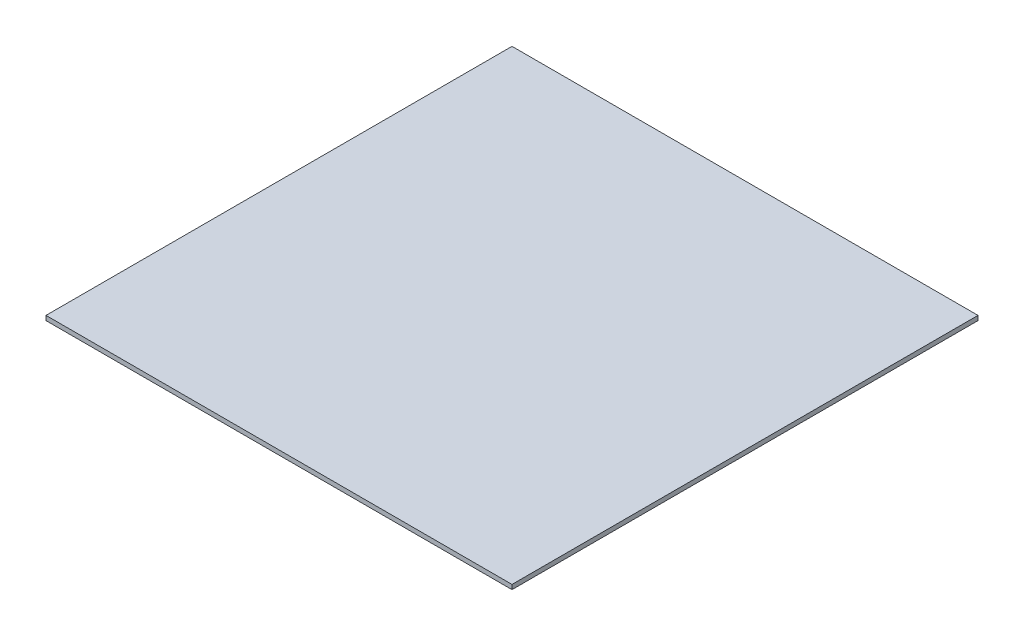
ISO-10303-21;
HEADER;
FILE_DESCRIPTION(('STEP AP214'),'2;1');
FILE_NAME('part.step','',(''),(''),'','','');
FILE_SCHEMA(('AUTOMOTIVE_DESIGN { 1 0 10303 214 1 1 1 1 }'));
ENDSEC;
DATA;
#1=APPLICATION_CONTEXT('core data for automotive mechanical design processes');
#2=APPLICATION_PROTOCOL_DEFINITION('international standard','automotive_design',2000,#1);
#3=PRODUCT_CONTEXT('',#1,'mechanical');
#4=PRODUCT('Part','Part','',(#3));
#5=PRODUCT_RELATED_PRODUCT_CATEGORY('part','',(#4));
#6=PRODUCT_DEFINITION_FORMATION('','',#4);
#7=PRODUCT_DEFINITION_CONTEXT('part definition',#1,'design');
#8=PRODUCT_DEFINITION('design','',#6,#7);
#9=PRODUCT_DEFINITION_SHAPE('','',#8);
#10=(LENGTH_UNIT() NAMED_UNIT(*) SI_UNIT(.MILLI.,.METRE.));
#11=(NAMED_UNIT(*) PLANE_ANGLE_UNIT() SI_UNIT($,.RADIAN.));
#12=(NAMED_UNIT(*) SI_UNIT($,.STERADIAN.) SOLID_ANGLE_UNIT());
#13=UNCERTAINTY_MEASURE_WITH_UNIT(LENGTH_MEASURE(1.E-05),#10,'distance_accuracy_value','');
#14=(GEOMETRIC_REPRESENTATION_CONTEXT(3) GLOBAL_UNCERTAINTY_ASSIGNED_CONTEXT((#13)) GLOBAL_UNIT_ASSIGNED_CONTEXT((#10,
#11,#12)) REPRESENTATION_CONTEXT('',''));
#15=CARTESIAN_POINT('',(0.,0.,0.));
#16=DIRECTION('',(0.,0.,1.));
#17=DIRECTION('',(1.,0.,0.));
#18=AXIS2_PLACEMENT_3D('',#15,#16,#17);
#19=CARTESIAN_POINT('',(205.,4.,205.));
#20=DIRECTION('',(-1.,0.,0.));
#21=DIRECTION('',(0.,0.,1.));
#22=AXIS2_PLACEMENT_3D('',#19,#20,#21);
#23=PLANE('',#22);
#24=DIRECTION('',(0.,0.,-1.));
#25=VECTOR('',#24,1.);
#26=CARTESIAN_POINT('',(205.,0.,205.));
#27=LINE('',#26,#25);
#28=CARTESIAN_POINT('',(205.,0.,205.));
#29=VERTEX_POINT('',#28);
#30=CARTESIAN_POINT('',(205.,0.,-205.));
#31=VERTEX_POINT('',#30);
#32=EDGE_CURVE('E100',#29,#31,#27,.T.);
#33=ORIENTED_EDGE('',*,*,#32,.T.);
#34=DIRECTION('',(0.,-1.,0.));
#35=VECTOR('',#34,1.);
#36=CARTESIAN_POINT('',(205.,4.,-205.));
#37=LINE('',#36,#35);
#38=CARTESIAN_POINT('',(205.,4.,-205.));
#39=VERTEX_POINT('',#38);
#40=EDGE_CURVE('E11',#39,#31,#37,.T.);
#41=ORIENTED_EDGE('',*,*,#40,.F.);
#42=DIRECTION('',(0.,0.,-1.));
#43=VECTOR('',#42,1.);
#44=CARTESIAN_POINT('',(205.,4.,205.));
#45=LINE('',#44,#43);
#46=CARTESIAN_POINT('',(205.,4.,205.));
#47=VERTEX_POINT('',#46);
#48=EDGE_CURVE('E88',#47,#39,#45,.T.);
#49=ORIENTED_EDGE('',*,*,#48,.F.);
#50=DIRECTION('',(0.,-1.,0.));
#51=VECTOR('',#50,1.);
#52=CARTESIAN_POINT('',(205.,4.,205.));
#53=LINE('',#52,#51);
#54=EDGE_CURVE('E96',#47,#29,#53,.T.);
#55=ORIENTED_EDGE('',*,*,#54,.T.);
#56=EDGE_LOOP('',(#33,#41,#49,#55));
#57=FACE_BOUND('',#56,.T.);
#58=ADVANCED_FACE('F37',(#57),#23,.F.);
#59=CARTESIAN_POINT('',(-205.,4.,-205.));
#60=DIRECTION('',(0.,0.,1.));
#61=DIRECTION('',(1.,0.,0.));
#62=AXIS2_PLACEMENT_3D('',#59,#60,#61);
#63=PLANE('',#62);
#64=DIRECTION('',(-1.,0.,0.));
#65=VECTOR('',#64,1.);
#66=CARTESIAN_POINT('',(-205.,0.,-205.));
#67=LINE('',#66,#65);
#68=CARTESIAN_POINT('',(-205.,0.,-205.));
#69=VERTEX_POINT('',#68);
#70=EDGE_CURVE('E92',#31,#69,#67,.T.);
#71=ORIENTED_EDGE('',*,*,#70,.T.);
#72=DIRECTION('',(0.,-1.,0.));
#73=VECTOR('',#72,1.);
#74=CARTESIAN_POINT('',(-205.,4.,-205.));
#75=LINE('',#74,#73);
#76=CARTESIAN_POINT('',(-205.,4.,-205.));
#77=VERTEX_POINT('',#76);
#78=EDGE_CURVE('E45',#77,#69,#75,.T.);
#79=ORIENTED_EDGE('',*,*,#78,.F.);
#80=DIRECTION('',(-1.,0.,0.));
#81=VECTOR('',#80,1.);
#82=CARTESIAN_POINT('',(-205.,4.,-205.));
#83=LINE('',#82,#81);
#84=EDGE_CURVE('E83',#39,#77,#83,.T.);
#85=ORIENTED_EDGE('',*,*,#84,.F.);
#86=ORIENTED_EDGE('',*,*,#40,.T.);
#87=EDGE_LOOP('',(#71,#79,#85,#86));
#88=FACE_BOUND('',#87,.T.);
#89=ADVANCED_FACE('F91',(#88),#63,.F.);
#90=CARTESIAN_POINT('',(-205.,4.,205.));
#91=DIRECTION('',(1.,0.,0.));
#92=DIRECTION('',(0.,0.,-1.));
#93=AXIS2_PLACEMENT_3D('',#90,#91,#92);
#94=PLANE('',#93);
#95=DIRECTION('',(0.,0.,1.));
#96=VECTOR('',#95,1.);
#97=CARTESIAN_POINT('',(-205.,0.,205.));
#98=LINE('',#97,#96);
#99=CARTESIAN_POINT('',(-205.,0.,205.));
#100=VERTEX_POINT('',#99);
#101=EDGE_CURVE('E70',#69,#100,#98,.T.);
#102=ORIENTED_EDGE('',*,*,#101,.T.);
#103=DIRECTION('',(0.,-1.,0.));
#104=VECTOR('',#103,1.);
#105=CARTESIAN_POINT('',(-205.,4.,205.));
#106=LINE('',#105,#104);
#107=CARTESIAN_POINT('',(-205.,4.,205.));
#108=VERTEX_POINT('',#107);
#109=EDGE_CURVE('E93',#108,#100,#106,.T.);
#110=ORIENTED_EDGE('',*,*,#109,.F.);
#111=DIRECTION('',(0.,0.,1.));
#112=VECTOR('',#111,1.);
#113=CARTESIAN_POINT('',(-205.,4.,205.));
#114=LINE('',#113,#112);
#115=EDGE_CURVE('E86',#77,#108,#114,.T.);
#116=ORIENTED_EDGE('',*,*,#115,.F.);
#117=ORIENTED_EDGE('',*,*,#78,.T.);
#118=EDGE_LOOP('',(#102,#110,#116,#117));
#119=FACE_BOUND('',#118,.T.);
#120=ADVANCED_FACE('F94',(#119),#94,.F.);
#121=CARTESIAN_POINT('',(-205.,4.,205.));
#122=DIRECTION('',(0.,0.,-1.));
#123=DIRECTION('',(-1.,0.,0.));
#124=AXIS2_PLACEMENT_3D('',#121,#122,#123);
#125=PLANE('',#124);
#126=DIRECTION('',(1.,0.,0.));
#127=VECTOR('',#126,1.);
#128=CARTESIAN_POINT('',(-205.,0.,205.));
#129=LINE('',#128,#127);
#130=EDGE_CURVE('E76',#100,#29,#129,.T.);
#131=ORIENTED_EDGE('',*,*,#130,.T.);
#132=ORIENTED_EDGE('',*,*,#54,.F.);
#133=DIRECTION('',(1.,0.,0.));
#134=VECTOR('',#133,1.);
#135=CARTESIAN_POINT('',(-205.,4.,205.));
#136=LINE('',#135,#134);
#137=EDGE_CURVE('E53',#108,#47,#136,.T.);
#138=ORIENTED_EDGE('',*,*,#137,.F.);
#139=ORIENTED_EDGE('',*,*,#109,.T.);
#140=EDGE_LOOP('',(#131,#132,#138,#139));
#141=FACE_BOUND('',#140,.T.);
#142=ADVANCED_FACE('F107',(#141),#125,.F.);
#143=CARTESIAN_POINT('',(0.,4.,0.));
#144=DIRECTION('',(0.,-1.,0.));
#145=DIRECTION('',(0.,0.,-1.));
#146=AXIS2_PLACEMENT_3D('',#143,#144,#145);
#147=PLANE('',#146);
#148=ORIENTED_EDGE('',*,*,#48,.T.);
#149=ORIENTED_EDGE('',*,*,#84,.T.);
#150=ORIENTED_EDGE('',*,*,#115,.T.);
#151=ORIENTED_EDGE('',*,*,#137,.T.);
#152=EDGE_LOOP('',(#148,#149,#150,#151));
#153=FACE_BOUND('',#152,.T.);
#154=ADVANCED_FACE('F84',(#153),#147,.F.);
#155=CARTESIAN_POINT('',(0.,0.,0.));
#156=DIRECTION('',(0.,-1.,0.));
#157=DIRECTION('',(0.,0.,-1.));
#158=AXIS2_PLACEMENT_3D('',#155,#156,#157);
#159=PLANE('',#158);
#160=ORIENTED_EDGE('',*,*,#32,.F.);
#161=ORIENTED_EDGE('',*,*,#130,.F.);
#162=ORIENTED_EDGE('',*,*,#101,.F.);
#163=ORIENTED_EDGE('',*,*,#70,.F.);
#164=EDGE_LOOP('',(#160,#161,#162,#163));
#165=FACE_BOUND('',#164,.T.);
#166=ADVANCED_FACE('F110',(#165),#159,.T.);
#167=CLOSED_SHELL('',(#58,#89,#120,#142,#154,#166));
#168=MANIFOLD_SOLID_BREP('B2',#167);
#169=ADVANCED_BREP_SHAPE_REPRESENTATION('',(#18,#168),#14);
#170=SHAPE_DEFINITION_REPRESENTATION(#9,#169);
ENDSEC;
END-ISO-10303-21;
